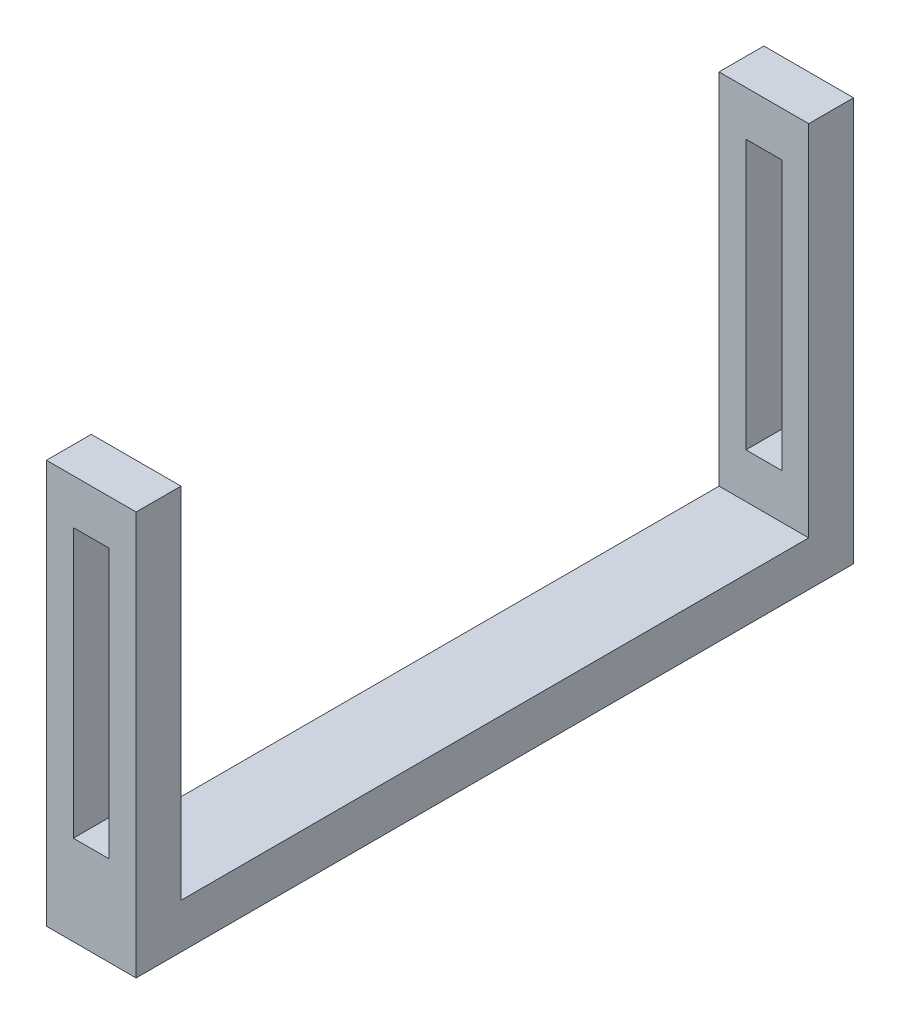
ISO-10303-21;
HEADER;
FILE_DESCRIPTION(('STEP AP214'),'2;1');
FILE_NAME('part.step','',(''),(''),'','','');
FILE_SCHEMA(('AUTOMOTIVE_DESIGN { 1 0 10303 214 1 1 1 1 }'));
ENDSEC;
DATA;
#1=APPLICATION_CONTEXT('core data for automotive mechanical design processes');
#2=APPLICATION_PROTOCOL_DEFINITION('international standard','automotive_design',2000,#1);
#3=PRODUCT_CONTEXT('',#1,'mechanical');
#4=PRODUCT('Part','Part','',(#3));
#5=PRODUCT_RELATED_PRODUCT_CATEGORY('part','',(#4));
#6=PRODUCT_DEFINITION_FORMATION('','',#4);
#7=PRODUCT_DEFINITION_CONTEXT('part definition',#1,'design');
#8=PRODUCT_DEFINITION('design','',#6,#7);
#9=PRODUCT_DEFINITION_SHAPE('','',#8);
#10=(LENGTH_UNIT() NAMED_UNIT(*) SI_UNIT(.MILLI.,.METRE.));
#11=(NAMED_UNIT(*) PLANE_ANGLE_UNIT() SI_UNIT($,.RADIAN.));
#12=(NAMED_UNIT(*) SI_UNIT($,.STERADIAN.) SOLID_ANGLE_UNIT());
#13=UNCERTAINTY_MEASURE_WITH_UNIT(LENGTH_MEASURE(1.E-05),#10,'distance_accuracy_value','');
#14=(GEOMETRIC_REPRESENTATION_CONTEXT(3) GLOBAL_UNCERTAINTY_ASSIGNED_CONTEXT((#13)) GLOBAL_UNIT_ASSIGNED_CONTEXT((#10,
#11,#12)) REPRESENTATION_CONTEXT('',''));
#15=CARTESIAN_POINT('',(0.,0.,0.));
#16=DIRECTION('',(0.,0.,1.));
#17=DIRECTION('',(1.,0.,0.));
#18=AXIS2_PLACEMENT_3D('',#15,#16,#17);
#19=CARTESIAN_POINT('',(10.,0.,10.));
#20=DIRECTION('',(-1.,0.,0.));
#21=DIRECTION('',(0.,0.,1.));
#22=AXIS2_PLACEMENT_3D('',#19,#20,#21);
#23=PLANE('',#22);
#24=DIRECTION('',(0.,1.,0.));
#25=VECTOR('',#24,1.);
#26=CARTESIAN_POINT('',(10.,0.,0.));
#27=LINE('',#26,#25);
#28=CARTESIAN_POINT('',(10.,-50.,0.));
#29=VERTEX_POINT('',#28);
#30=CARTESIAN_POINT('',(10.,40.,0.));
#31=VERTEX_POINT('',#30);
#32=EDGE_CURVE('E143',#29,#31,#27,.T.);
#33=ORIENTED_EDGE('',*,*,#32,.T.);
#34=DIRECTION('',(0.,0.,-1.));
#35=VECTOR('',#34,1.);
#36=CARTESIAN_POINT('',(10.,40.,10.));
#37=LINE('',#36,#35);
#38=CARTESIAN_POINT('',(10.,40.,10.));
#39=VERTEX_POINT('',#38);
#40=EDGE_CURVE('E11',#39,#31,#37,.T.);
#41=ORIENTED_EDGE('',*,*,#40,.F.);
#42=DIRECTION('',(0.,1.,0.));
#43=VECTOR('',#42,1.);
#44=CARTESIAN_POINT('',(10.,0.,10.));
#45=LINE('',#44,#43);
#46=CARTESIAN_POINT('',(10.,-40.,10.));
#47=VERTEX_POINT('',#46);
#48=EDGE_CURVE('E117',#47,#39,#45,.T.);
#49=ORIENTED_EDGE('',*,*,#48,.F.);
#50=DIRECTION('',(0.,0.,-1.));
#51=VECTOR('',#50,1.);
#52=CARTESIAN_POINT('',(10.,-40.,80.));
#53=LINE('',#52,#51);
#54=CARTESIAN_POINT('',(10.,-40.,150.));
#55=VERTEX_POINT('',#54);
#56=EDGE_CURVE('E101',#55,#47,#53,.T.);
#57=ORIENTED_EDGE('',*,*,#56,.F.);
#58=DIRECTION('',(0.,1.,0.));
#59=VECTOR('',#58,1.);
#60=CARTESIAN_POINT('',(10.,0.,150.));
#61=LINE('',#60,#59);
#62=CARTESIAN_POINT('',(10.,40.,150.));
#63=VERTEX_POINT('',#62);
#64=EDGE_CURVE('E237',#55,#63,#61,.T.);
#65=ORIENTED_EDGE('',*,*,#64,.T.);
#66=DIRECTION('',(0.,0.,1.));
#67=VECTOR('',#66,1.);
#68=CARTESIAN_POINT('',(10.,40.,150.));
#69=LINE('',#68,#67);
#70=CARTESIAN_POINT('',(10.,40.,160.));
#71=VERTEX_POINT('',#70);
#72=EDGE_CURVE('E190',#63,#71,#69,.T.);
#73=ORIENTED_EDGE('',*,*,#72,.T.);
#74=DIRECTION('',(0.,1.,0.));
#75=VECTOR('',#74,1.);
#76=CARTESIAN_POINT('',(10.,0.,160.));
#77=LINE('',#76,#75);
#78=CARTESIAN_POINT('',(10.,-50.,160.));
#79=VERTEX_POINT('',#78);
#80=EDGE_CURVE('E216',#79,#71,#77,.T.);
#81=ORIENTED_EDGE('',*,*,#80,.F.);
#82=DIRECTION('',(0.,0.,-1.));
#83=VECTOR('',#82,1.);
#84=CARTESIAN_POINT('',(10.,-50.,80.));
#85=LINE('',#84,#83);
#86=EDGE_CURVE('E184',#79,#29,#85,.T.);
#87=ORIENTED_EDGE('',*,*,#86,.T.);
#88=EDGE_LOOP('',(#33,#41,#49,#57,#65,#73,#81,#87));
#89=FACE_BOUND('',#88,.T.);
#90=ADVANCED_FACE('F35',(#89),#23,.F.);
#91=CARTESIAN_POINT('',(0.,40.,10.));
#92=DIRECTION('',(0.,1.,0.));
#93=DIRECTION('',(0.,0.,1.));
#94=AXIS2_PLACEMENT_3D('',#91,#92,#93);
#95=PLANE('',#94);
#96=DIRECTION('',(1.,0.,0.));
#97=VECTOR('',#96,1.);
#98=CARTESIAN_POINT('',(0.,40.,0.));
#99=LINE('',#98,#97);
#100=CARTESIAN_POINT('',(-10.,40.,0.));
#101=VERTEX_POINT('',#100);
#102=EDGE_CURVE('E145',#101,#31,#99,.T.);
#103=ORIENTED_EDGE('',*,*,#102,.F.);
#104=DIRECTION('',(0.,0.,-1.));
#105=VECTOR('',#104,1.);
#106=CARTESIAN_POINT('',(-10.,40.,10.));
#107=LINE('',#106,#105);
#108=CARTESIAN_POINT('',(-10.,40.,10.));
#109=VERTEX_POINT('',#108);
#110=EDGE_CURVE('E45',#109,#101,#107,.T.);
#111=ORIENTED_EDGE('',*,*,#110,.F.);
#112=DIRECTION('',(1.,0.,0.));
#113=VECTOR('',#112,1.);
#114=CARTESIAN_POINT('',(0.,40.,10.));
#115=LINE('',#114,#113);
#116=EDGE_CURVE('E119',#109,#39,#115,.T.);
#117=ORIENTED_EDGE('',*,*,#116,.T.);
#118=ORIENTED_EDGE('',*,*,#40,.T.);
#119=EDGE_LOOP('',(#103,#111,#117,#118));
#120=FACE_BOUND('',#119,.T.);
#121=ADVANCED_FACE('F296',(#120),#95,.T.);
#122=CARTESIAN_POINT('',(4.,0.,10.));
#123=DIRECTION('',(-1.,0.,0.));
#124=DIRECTION('',(0.,0.,1.));
#125=AXIS2_PLACEMENT_3D('',#122,#123,#124);
#126=PLANE('',#125);
#127=DIRECTION('',(0.,1.,0.));
#128=VECTOR('',#127,1.);
#129=CARTESIAN_POINT('',(4.,0.,0.));
#130=LINE('',#129,#128);
#131=CARTESIAN_POINT('',(4.,-30.,0.));
#132=VERTEX_POINT('',#131);
#133=CARTESIAN_POINT('',(4.,30.,0.));
#134=VERTEX_POINT('',#133);
#135=EDGE_CURVE('E114',#132,#134,#130,.T.);
#136=ORIENTED_EDGE('',*,*,#135,.F.);
#137=DIRECTION('',(0.,0.,-1.));
#138=VECTOR('',#137,1.);
#139=CARTESIAN_POINT('',(4.,-30.,10.));
#140=LINE('',#139,#138);
#141=CARTESIAN_POINT('',(4.,-30.,10.));
#142=VERTEX_POINT('',#141);
#143=EDGE_CURVE('E39',#142,#132,#140,.T.);
#144=ORIENTED_EDGE('',*,*,#143,.F.);
#145=DIRECTION('',(0.,1.,0.));
#146=VECTOR('',#145,1.);
#147=CARTESIAN_POINT('',(4.,0.,10.));
#148=LINE('',#147,#146);
#149=CARTESIAN_POINT('',(4.,30.,10.));
#150=VERTEX_POINT('',#149);
#151=EDGE_CURVE('E151',#142,#150,#148,.T.);
#152=ORIENTED_EDGE('',*,*,#151,.T.);
#153=DIRECTION('',(0.,0.,-1.));
#154=VECTOR('',#153,1.);
#155=CARTESIAN_POINT('',(4.,30.,10.));
#156=LINE('',#155,#154);
#157=EDGE_CURVE('E132',#150,#134,#156,.T.);
#158=ORIENTED_EDGE('',*,*,#157,.T.);
#159=EDGE_LOOP('',(#136,#144,#152,#158));
#160=FACE_BOUND('',#159,.T.);
#161=ADVANCED_FACE('F37',(#160),#126,.T.);
#162=CARTESIAN_POINT('',(0.,-30.,10.));
#163=DIRECTION('',(0.,1.,0.));
#164=DIRECTION('',(0.,0.,1.));
#165=AXIS2_PLACEMENT_3D('',#162,#163,#164);
#166=PLANE('',#165);
#167=DIRECTION('',(1.,0.,0.));
#168=VECTOR('',#167,1.);
#169=CARTESIAN_POINT('',(0.,-30.,0.));
#170=LINE('',#169,#168);
#171=CARTESIAN_POINT('',(-4.,-30.,0.));
#172=VERTEX_POINT('',#171);
#173=EDGE_CURVE('E135',#172,#132,#170,.T.);
#174=ORIENTED_EDGE('',*,*,#173,.F.);
#175=DIRECTION('',(0.,0.,-1.));
#176=VECTOR('',#175,1.);
#177=CARTESIAN_POINT('',(-4.,-30.,10.));
#178=LINE('',#177,#176);
#179=CARTESIAN_POINT('',(-4.,-30.,10.));
#180=VERTEX_POINT('',#179);
#181=EDGE_CURVE('E156',#180,#172,#178,.T.);
#182=ORIENTED_EDGE('',*,*,#181,.F.);
#183=DIRECTION('',(1.,0.,0.));
#184=VECTOR('',#183,1.);
#185=CARTESIAN_POINT('',(0.,-30.,10.));
#186=LINE('',#185,#184);
#187=EDGE_CURVE('E165',#180,#142,#186,.T.);
#188=ORIENTED_EDGE('',*,*,#187,.T.);
#189=ORIENTED_EDGE('',*,*,#143,.T.);
#190=EDGE_LOOP('',(#174,#182,#188,#189));
#191=FACE_BOUND('',#190,.T.);
#192=ADVANCED_FACE('F163',(#191),#166,.T.);
#193=CARTESIAN_POINT('',(-4.,0.,10.));
#194=DIRECTION('',(-1.,0.,0.));
#195=DIRECTION('',(0.,0.,1.));
#196=AXIS2_PLACEMENT_3D('',#193,#194,#195);
#197=PLANE('',#196);
#198=DIRECTION('',(0.,1.,0.));
#199=VECTOR('',#198,1.);
#200=CARTESIAN_POINT('',(-4.,0.,0.));
#201=LINE('',#200,#199);
#202=CARTESIAN_POINT('',(-4.,30.,0.));
#203=VERTEX_POINT('',#202);
#204=EDGE_CURVE('E138',#172,#203,#201,.T.);
#205=ORIENTED_EDGE('',*,*,#204,.T.);
#206=DIRECTION('',(0.,0.,-1.));
#207=VECTOR('',#206,1.);
#208=CARTESIAN_POINT('',(-4.,30.,10.));
#209=LINE('',#208,#207);
#210=CARTESIAN_POINT('',(-4.,30.,10.));
#211=VERTEX_POINT('',#210);
#212=EDGE_CURVE('E154',#211,#203,#209,.T.);
#213=ORIENTED_EDGE('',*,*,#212,.F.);
#214=DIRECTION('',(0.,1.,0.));
#215=VECTOR('',#214,1.);
#216=CARTESIAN_POINT('',(-4.,0.,10.));
#217=LINE('',#216,#215);
#218=EDGE_CURVE('E126',#180,#211,#217,.T.);
#219=ORIENTED_EDGE('',*,*,#218,.F.);
#220=ORIENTED_EDGE('',*,*,#181,.T.);
#221=EDGE_LOOP('',(#205,#213,#219,#220));
#222=FACE_BOUND('',#221,.T.);
#223=ADVANCED_FACE('F172',(#222),#197,.F.);
#224=CARTESIAN_POINT('',(0.,30.,10.));
#225=DIRECTION('',(0.,1.,0.));
#226=DIRECTION('',(0.,0.,1.));
#227=AXIS2_PLACEMENT_3D('',#224,#225,#226);
#228=PLANE('',#227);
#229=DIRECTION('',(1.,0.,0.));
#230=VECTOR('',#229,1.);
#231=CARTESIAN_POINT('',(0.,30.,0.));
#232=LINE('',#231,#230);
#233=EDGE_CURVE('E140',#203,#134,#232,.T.);
#234=ORIENTED_EDGE('',*,*,#233,.T.);
#235=ORIENTED_EDGE('',*,*,#157,.F.);
#236=DIRECTION('',(1.,0.,0.));
#237=VECTOR('',#236,1.);
#238=CARTESIAN_POINT('',(0.,30.,10.));
#239=LINE('',#238,#237);
#240=EDGE_CURVE('E124',#211,#150,#239,.T.);
#241=ORIENTED_EDGE('',*,*,#240,.F.);
#242=ORIENTED_EDGE('',*,*,#212,.T.);
#243=EDGE_LOOP('',(#234,#235,#241,#242));
#244=FACE_BOUND('',#243,.T.);
#245=ADVANCED_FACE('F175',(#244),#228,.F.);
#246=CARTESIAN_POINT('',(-10.,0.,10.));
#247=DIRECTION('',(-1.,0.,0.));
#248=DIRECTION('',(0.,0.,1.));
#249=AXIS2_PLACEMENT_3D('',#246,#247,#248);
#250=PLANE('',#249);
#251=DIRECTION('',(0.,1.,0.));
#252=VECTOR('',#251,1.);
#253=CARTESIAN_POINT('',(-10.,0.,0.));
#254=LINE('',#253,#252);
#255=CARTESIAN_POINT('',(-10.,-50.,0.));
#256=VERTEX_POINT('',#255);
#257=EDGE_CURVE('E148',#256,#101,#254,.T.);
#258=ORIENTED_EDGE('',*,*,#257,.F.);
#259=DIRECTION('',(0.,0.,-1.));
#260=VECTOR('',#259,1.);
#261=CARTESIAN_POINT('',(-10.,-50.,80.));
#262=LINE('',#261,#260);
#263=CARTESIAN_POINT('',(-10.,-50.,160.));
#264=VERTEX_POINT('',#263);
#265=EDGE_CURVE('E181',#264,#256,#262,.T.);
#266=ORIENTED_EDGE('',*,*,#265,.F.);
#267=DIRECTION('',(0.,1.,0.));
#268=VECTOR('',#267,1.);
#269=CARTESIAN_POINT('',(-10.,0.,160.));
#270=LINE('',#269,#268);
#271=CARTESIAN_POINT('',(-10.,40.,160.));
#272=VERTEX_POINT('',#271);
#273=EDGE_CURVE('E209',#264,#272,#270,.T.);
#274=ORIENTED_EDGE('',*,*,#273,.T.);
#275=DIRECTION('',(0.,0.,1.));
#276=VECTOR('',#275,1.);
#277=CARTESIAN_POINT('',(-10.,40.,150.));
#278=LINE('',#277,#276);
#279=CARTESIAN_POINT('',(-10.,40.,150.));
#280=VERTEX_POINT('',#279);
#281=EDGE_CURVE('E194',#280,#272,#278,.T.);
#282=ORIENTED_EDGE('',*,*,#281,.F.);
#283=DIRECTION('',(0.,1.,0.));
#284=VECTOR('',#283,1.);
#285=CARTESIAN_POINT('',(-10.,0.,150.));
#286=LINE('',#285,#284);
#287=CARTESIAN_POINT('',(-10.,-40.,150.));
#288=VERTEX_POINT('',#287);
#289=EDGE_CURVE('E204',#288,#280,#286,.T.);
#290=ORIENTED_EDGE('',*,*,#289,.F.);
#291=DIRECTION('',(0.,0.,-1.));
#292=VECTOR('',#291,1.);
#293=CARTESIAN_POINT('',(-10.,-40.,80.));
#294=LINE('',#293,#292);
#295=CARTESIAN_POINT('',(-10.,-40.,9.99999999999999));
#296=VERTEX_POINT('',#295);
#297=EDGE_CURVE('E115',#288,#296,#294,.T.);
#298=ORIENTED_EDGE('',*,*,#297,.T.);
#299=DIRECTION('',(0.,1.,0.));
#300=VECTOR('',#299,1.);
#301=CARTESIAN_POINT('',(-10.,0.,10.));
#302=LINE('',#301,#300);
#303=EDGE_CURVE('E123',#296,#109,#302,.T.);
#304=ORIENTED_EDGE('',*,*,#303,.T.);
#305=ORIENTED_EDGE('',*,*,#110,.T.);
#306=EDGE_LOOP('',(#258,#266,#274,#282,#290,#298,#304,#305));
#307=FACE_BOUND('',#306,.T.);
#308=ADVANCED_FACE('F305',(#307),#250,.T.);
#309=CARTESIAN_POINT('',(0.,0.,10.));
#310=DIRECTION('',(0.,0.,1.));
#311=DIRECTION('',(1.,0.,0.));
#312=AXIS2_PLACEMENT_3D('',#309,#310,#311);
#313=PLANE('',#312);
#314=ORIENTED_EDGE('',*,*,#151,.F.);
#315=ORIENTED_EDGE('',*,*,#187,.F.);
#316=ORIENTED_EDGE('',*,*,#218,.T.);
#317=ORIENTED_EDGE('',*,*,#240,.T.);
#318=EDGE_LOOP('',(#314,#315,#316,#317));
#319=FACE_BOUND('',#318,.T.);
#320=DIRECTION('',(1.,0.,0.));
#321=VECTOR('',#320,1.);
#322=CARTESIAN_POINT('',(0.,-40.,10.));
#323=LINE('',#322,#321);
#324=EDGE_CURVE('E106',#296,#47,#323,.T.);
#325=ORIENTED_EDGE('',*,*,#324,.T.);
#326=ORIENTED_EDGE('',*,*,#48,.T.);
#327=ORIENTED_EDGE('',*,*,#116,.F.);
#328=ORIENTED_EDGE('',*,*,#303,.F.);
#329=EDGE_LOOP('',(#325,#326,#327,#328));
#330=FACE_BOUND('',#329,.T.);
#331=ADVANCED_FACE('F122',(#319,#330),#313,.T.);
#332=CARTESIAN_POINT('',(0.,0.,0.));
#333=DIRECTION('',(0.,0.,1.));
#334=DIRECTION('',(1.,0.,0.));
#335=AXIS2_PLACEMENT_3D('',#332,#333,#334);
#336=PLANE('',#335);
#337=ORIENTED_EDGE('',*,*,#135,.T.);
#338=ORIENTED_EDGE('',*,*,#233,.F.);
#339=ORIENTED_EDGE('',*,*,#204,.F.);
#340=ORIENTED_EDGE('',*,*,#173,.T.);
#341=EDGE_LOOP('',(#337,#338,#339,#340));
#342=FACE_BOUND('',#341,.T.);
#343=ORIENTED_EDGE('',*,*,#32,.F.);
#344=DIRECTION('',(1.,0.,0.));
#345=VECTOR('',#344,1.);
#346=CARTESIAN_POINT('',(0.,-50.,0.));
#347=LINE('',#346,#345);
#348=EDGE_CURVE('E187',#256,#29,#347,.T.);
#349=ORIENTED_EDGE('',*,*,#348,.F.);
#350=ORIENTED_EDGE('',*,*,#257,.T.);
#351=ORIENTED_EDGE('',*,*,#102,.T.);
#352=EDGE_LOOP('',(#343,#349,#350,#351));
#353=FACE_BOUND('',#352,.T.);
#354=ADVANCED_FACE('F169',(#342,#353),#336,.F.);
#355=CARTESIAN_POINT('',(0.,-40.,80.));
#356=DIRECTION('',(0.,1.,0.));
#357=DIRECTION('',(0.,0.,1.));
#358=AXIS2_PLACEMENT_3D('',#355,#356,#357);
#359=PLANE('',#358);
#360=ORIENTED_EDGE('',*,*,#324,.F.);
#361=ORIENTED_EDGE('',*,*,#297,.F.);
#362=DIRECTION('',(1.,0.,0.));
#363=VECTOR('',#362,1.);
#364=CARTESIAN_POINT('',(0.,-40.,150.));
#365=LINE('',#364,#363);
#366=EDGE_CURVE('E110',#288,#55,#365,.T.);
#367=ORIENTED_EDGE('',*,*,#366,.T.);
#368=ORIENTED_EDGE('',*,*,#56,.T.);
#369=EDGE_LOOP('',(#360,#361,#367,#368));
#370=FACE_BOUND('',#369,.T.);
#371=ADVANCED_FACE('F103',(#370),#359,.T.);
#372=CARTESIAN_POINT('',(0.,-50.,80.));
#373=DIRECTION('',(0.,1.,0.));
#374=DIRECTION('',(0.,0.,1.));
#375=AXIS2_PLACEMENT_3D('',#372,#373,#374);
#376=PLANE('',#375);
#377=ORIENTED_EDGE('',*,*,#348,.T.);
#378=ORIENTED_EDGE('',*,*,#86,.F.);
#379=DIRECTION('',(1.,0.,0.));
#380=VECTOR('',#379,1.);
#381=CARTESIAN_POINT('',(0.,-50.,160.));
#382=LINE('',#381,#380);
#383=EDGE_CURVE('E231',#264,#79,#382,.T.);
#384=ORIENTED_EDGE('',*,*,#383,.F.);
#385=ORIENTED_EDGE('',*,*,#265,.T.);
#386=EDGE_LOOP('',(#377,#378,#384,#385));
#387=FACE_BOUND('',#386,.T.);
#388=ADVANCED_FACE('F347',(#387),#376,.F.);
#389=CARTESIAN_POINT('',(0.,40.,150.));
#390=DIRECTION('',(0.,1.,0.));
#391=DIRECTION('',(0.,0.,-1.));
#392=AXIS2_PLACEMENT_3D('',#389,#390,#391);
#393=PLANE('',#392);
#394=DIRECTION('',(1.,0.,0.));
#395=VECTOR('',#394,1.);
#396=CARTESIAN_POINT('',(0.,40.,160.));
#397=LINE('',#396,#395);
#398=EDGE_CURVE('E213',#272,#71,#397,.T.);
#399=ORIENTED_EDGE('',*,*,#398,.T.);
#400=ORIENTED_EDGE('',*,*,#72,.F.);
#401=DIRECTION('',(1.,0.,0.));
#402=VECTOR('',#401,1.);
#403=CARTESIAN_POINT('',(0.,40.,150.));
#404=LINE('',#403,#402);
#405=EDGE_CURVE('E234',#280,#63,#404,.T.);
#406=ORIENTED_EDGE('',*,*,#405,.F.);
#407=ORIENTED_EDGE('',*,*,#281,.T.);
#408=EDGE_LOOP('',(#399,#400,#406,#407));
#409=FACE_BOUND('',#408,.T.);
#410=ADVANCED_FACE('F273',(#409),#393,.T.);
#411=CARTESIAN_POINT('',(4.,0.,150.));
#412=DIRECTION('',(-1.,0.,0.));
#413=DIRECTION('',(0.,0.,-1.));
#414=AXIS2_PLACEMENT_3D('',#411,#412,#413);
#415=PLANE('',#414);
#416=DIRECTION('',(0.,1.,0.));
#417=VECTOR('',#416,1.);
#418=CARTESIAN_POINT('',(4.,0.,160.));
#419=LINE('',#418,#417);
#420=CARTESIAN_POINT('',(4.,-30.,160.));
#421=VERTEX_POINT('',#420);
#422=CARTESIAN_POINT('',(4.,30.,160.));
#423=VERTEX_POINT('',#422);
#424=EDGE_CURVE('E228',#421,#423,#419,.T.);
#425=ORIENTED_EDGE('',*,*,#424,.T.);
#426=DIRECTION('',(0.,0.,1.));
#427=VECTOR('',#426,1.);
#428=CARTESIAN_POINT('',(4.,30.,150.));
#429=LINE('',#428,#427);
#430=CARTESIAN_POINT('',(4.,30.,150.));
#431=VERTEX_POINT('',#430);
#432=EDGE_CURVE('E201',#431,#423,#429,.T.);
#433=ORIENTED_EDGE('',*,*,#432,.F.);
#434=DIRECTION('',(0.,1.,0.));
#435=VECTOR('',#434,1.);
#436=CARTESIAN_POINT('',(4.,0.,150.));
#437=LINE('',#436,#435);
#438=CARTESIAN_POINT('',(4.,-30.,150.));
#439=VERTEX_POINT('',#438);
#440=EDGE_CURVE('E212',#439,#431,#437,.T.);
#441=ORIENTED_EDGE('',*,*,#440,.F.);
#442=DIRECTION('',(0.,0.,1.));
#443=VECTOR('',#442,1.);
#444=CARTESIAN_POINT('',(4.,-30.,150.));
#445=LINE('',#444,#443);
#446=EDGE_CURVE('E191',#439,#421,#445,.T.);
#447=ORIENTED_EDGE('',*,*,#446,.T.);
#448=EDGE_LOOP('',(#425,#433,#441,#447));
#449=FACE_BOUND('',#448,.T.);
#450=ADVANCED_FACE('F360',(#449),#415,.T.);
#451=CARTESIAN_POINT('',(0.,-30.,150.));
#452=DIRECTION('',(0.,1.,0.));
#453=DIRECTION('',(0.,0.,-1.));
#454=AXIS2_PLACEMENT_3D('',#451,#452,#453);
#455=PLANE('',#454);
#456=DIRECTION('',(1.,0.,0.));
#457=VECTOR('',#456,1.);
#458=CARTESIAN_POINT('',(0.,-30.,160.));
#459=LINE('',#458,#457);
#460=CARTESIAN_POINT('',(-4.,-30.,160.));
#461=VERTEX_POINT('',#460);
#462=EDGE_CURVE('E225',#461,#421,#459,.T.);
#463=ORIENTED_EDGE('',*,*,#462,.T.);
#464=ORIENTED_EDGE('',*,*,#446,.F.);
#465=DIRECTION('',(1.,0.,0.));
#466=VECTOR('',#465,1.);
#467=CARTESIAN_POINT('',(0.,-30.,150.));
#468=LINE('',#467,#466);
#469=CARTESIAN_POINT('',(-4.,-30.,150.));
#470=VERTEX_POINT('',#469);
#471=EDGE_CURVE('E246',#470,#439,#468,.T.);
#472=ORIENTED_EDGE('',*,*,#471,.F.);
#473=DIRECTION('',(0.,0.,1.));
#474=VECTOR('',#473,1.);
#475=CARTESIAN_POINT('',(-4.,-30.,150.));
#476=LINE('',#475,#474);
#477=EDGE_CURVE('E195',#470,#461,#476,.T.);
#478=ORIENTED_EDGE('',*,*,#477,.T.);
#479=EDGE_LOOP('',(#463,#464,#472,#478));
#480=FACE_BOUND('',#479,.T.);
#481=ADVANCED_FACE('F367',(#480),#455,.T.);
#482=CARTESIAN_POINT('',(-4.,0.,150.));
#483=DIRECTION('',(-1.,0.,0.));
#484=DIRECTION('',(0.,0.,-1.));
#485=AXIS2_PLACEMENT_3D('',#482,#483,#484);
#486=PLANE('',#485);
#487=DIRECTION('',(0.,1.,0.));
#488=VECTOR('',#487,1.);
#489=CARTESIAN_POINT('',(-4.,0.,160.));
#490=LINE('',#489,#488);
#491=CARTESIAN_POINT('',(-4.,30.,160.));
#492=VERTEX_POINT('',#491);
#493=EDGE_CURVE('E222',#461,#492,#490,.T.);
#494=ORIENTED_EDGE('',*,*,#493,.F.);
#495=ORIENTED_EDGE('',*,*,#477,.F.);
#496=DIRECTION('',(0.,1.,0.));
#497=VECTOR('',#496,1.);
#498=CARTESIAN_POINT('',(-4.,0.,150.));
#499=LINE('',#498,#497);
#500=CARTESIAN_POINT('',(-4.,30.,150.));
#501=VERTEX_POINT('',#500);
#502=EDGE_CURVE('E243',#470,#501,#499,.T.);
#503=ORIENTED_EDGE('',*,*,#502,.T.);
#504=DIRECTION('',(0.,0.,1.));
#505=VECTOR('',#504,1.);
#506=CARTESIAN_POINT('',(-4.,30.,150.));
#507=LINE('',#506,#505);
#508=EDGE_CURVE('E198',#501,#492,#507,.T.);
#509=ORIENTED_EDGE('',*,*,#508,.T.);
#510=EDGE_LOOP('',(#494,#495,#503,#509));
#511=FACE_BOUND('',#510,.T.);
#512=ADVANCED_FACE('F375',(#511),#486,.F.);
#513=CARTESIAN_POINT('',(0.,30.,150.));
#514=DIRECTION('',(0.,1.,0.));
#515=DIRECTION('',(0.,0.,-1.));
#516=AXIS2_PLACEMENT_3D('',#513,#514,#515);
#517=PLANE('',#516);
#518=DIRECTION('',(1.,0.,0.));
#519=VECTOR('',#518,1.);
#520=CARTESIAN_POINT('',(0.,30.,160.));
#521=LINE('',#520,#519);
#522=EDGE_CURVE('E219',#492,#423,#521,.T.);
#523=ORIENTED_EDGE('',*,*,#522,.F.);
#524=ORIENTED_EDGE('',*,*,#508,.F.);
#525=DIRECTION('',(1.,0.,0.));
#526=VECTOR('',#525,1.);
#527=CARTESIAN_POINT('',(0.,30.,150.));
#528=LINE('',#527,#526);
#529=EDGE_CURVE('E240',#501,#431,#528,.T.);
#530=ORIENTED_EDGE('',*,*,#529,.T.);
#531=ORIENTED_EDGE('',*,*,#432,.T.);
#532=EDGE_LOOP('',(#523,#524,#530,#531));
#533=FACE_BOUND('',#532,.T.);
#534=ADVANCED_FACE('F383',(#533),#517,.F.);
#535=CARTESIAN_POINT('',(0.,0.,150.));
#536=DIRECTION('',(0.,0.,-1.));
#537=DIRECTION('',(1.,0.,0.));
#538=AXIS2_PLACEMENT_3D('',#535,#536,#537);
#539=PLANE('',#538);
#540=ORIENTED_EDGE('',*,*,#440,.T.);
#541=ORIENTED_EDGE('',*,*,#529,.F.);
#542=ORIENTED_EDGE('',*,*,#502,.F.);
#543=ORIENTED_EDGE('',*,*,#471,.T.);
#544=EDGE_LOOP('',(#540,#541,#542,#543));
#545=FACE_BOUND('',#544,.T.);
#546=ORIENTED_EDGE('',*,*,#366,.F.);
#547=ORIENTED_EDGE('',*,*,#289,.T.);
#548=ORIENTED_EDGE('',*,*,#405,.T.);
#549=ORIENTED_EDGE('',*,*,#64,.F.);
#550=EDGE_LOOP('',(#546,#547,#548,#549));
#551=FACE_BOUND('',#550,.T.);
#552=ADVANCED_FACE('F391',(#545,#551),#539,.T.);
#553=CARTESIAN_POINT('',(0.,0.,160.));
#554=DIRECTION('',(0.,0.,-1.));
#555=DIRECTION('',(1.,0.,0.));
#556=AXIS2_PLACEMENT_3D('',#553,#554,#555);
#557=PLANE('',#556);
#558=ORIENTED_EDGE('',*,*,#424,.F.);
#559=ORIENTED_EDGE('',*,*,#462,.F.);
#560=ORIENTED_EDGE('',*,*,#493,.T.);
#561=ORIENTED_EDGE('',*,*,#522,.T.);
#562=EDGE_LOOP('',(#558,#559,#560,#561));
#563=FACE_BOUND('',#562,.T.);
#564=ORIENTED_EDGE('',*,*,#80,.T.);
#565=ORIENTED_EDGE('',*,*,#398,.F.);
#566=ORIENTED_EDGE('',*,*,#273,.F.);
#567=ORIENTED_EDGE('',*,*,#383,.T.);
#568=EDGE_LOOP('',(#564,#565,#566,#567));
#569=FACE_BOUND('',#568,.T.);
#570=ADVANCED_FACE('F257',(#563,#569),#557,.F.);
#571=CLOSED_SHELL('',(#90,#121,#161,#192,#223,#245,#308,#331,#354,#371,#388,#410,#450,#481,#512,
#534,#552,#570));
#572=MANIFOLD_SOLID_BREP('B2',#571);
#573=ADVANCED_BREP_SHAPE_REPRESENTATION('',(#18,#572),#14);
#574=SHAPE_DEFINITION_REPRESENTATION(#9,#573);
ENDSEC;
END-ISO-10303-21;
